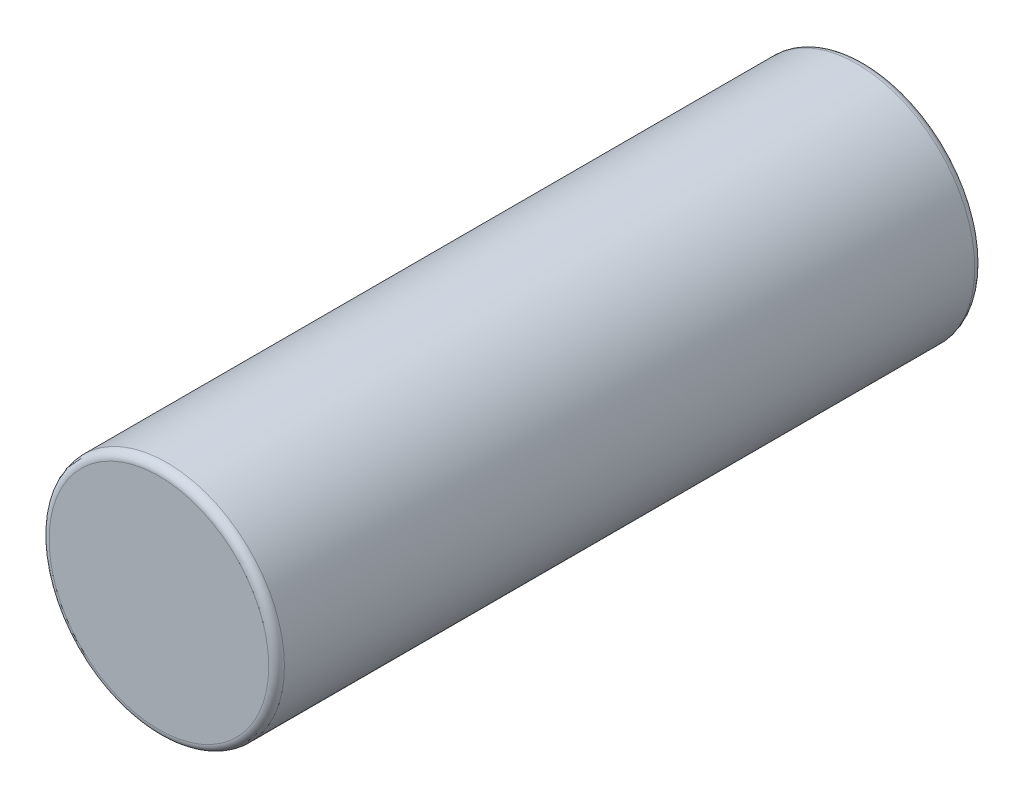
ISO-10303-21;
HEADER;
FILE_DESCRIPTION(('STEP AP214'),'2;1');
FILE_NAME('part.step','',(''),(''),'','','');
FILE_SCHEMA(('AUTOMOTIVE_DESIGN { 1 0 10303 214 1 1 1 1 }'));
ENDSEC;
DATA;
#1=APPLICATION_CONTEXT('core data for automotive mechanical design processes');
#2=APPLICATION_PROTOCOL_DEFINITION('international standard','automotive_design',2000,#1);
#3=PRODUCT_CONTEXT('',#1,'mechanical');
#4=PRODUCT('Part','Part','',(#3));
#5=PRODUCT_RELATED_PRODUCT_CATEGORY('part','',(#4));
#6=PRODUCT_DEFINITION_FORMATION('','',#4);
#7=PRODUCT_DEFINITION_CONTEXT('part definition',#1,'design');
#8=PRODUCT_DEFINITION('design','',#6,#7);
#9=PRODUCT_DEFINITION_SHAPE('','',#8);
#10=(LENGTH_UNIT() NAMED_UNIT(*) SI_UNIT(.MILLI.,.METRE.));
#11=(NAMED_UNIT(*) PLANE_ANGLE_UNIT() SI_UNIT($,.RADIAN.));
#12=(NAMED_UNIT(*) SI_UNIT($,.STERADIAN.) SOLID_ANGLE_UNIT());
#13=UNCERTAINTY_MEASURE_WITH_UNIT(LENGTH_MEASURE(1.E-05),#10,'distance_accuracy_value','');
#14=(GEOMETRIC_REPRESENTATION_CONTEXT(3) GLOBAL_UNCERTAINTY_ASSIGNED_CONTEXT((#13)) GLOBAL_UNIT_ASSIGNED_CONTEXT((#10,
#11,#12)) REPRESENTATION_CONTEXT('',''));
#15=CARTESIAN_POINT('',(0.,0.,0.));
#16=DIRECTION('',(0.,0.,1.));
#17=DIRECTION('',(1.,0.,0.));
#18=AXIS2_PLACEMENT_3D('',#15,#16,#17);
#19=CARTESIAN_POINT('',(0.,0.,-2.25));
#20=DIRECTION('',(0.,0.,1.));
#21=DIRECTION('',(1.,0.,0.));
#22=AXIS2_PLACEMENT_3D('',#19,#20,#21);
#23=CYLINDRICAL_SURFACE('',#22,0.75);
#24=CARTESIAN_POINT('',(0.,0.,-2.2));
#25=DIRECTION('',(0.,0.,1.));
#26=DIRECTION('',(1.,0.,0.));
#27=AXIS2_PLACEMENT_3D('',#24,#25,#26);
#28=CIRCLE('',#27,0.75);
#29=CARTESIAN_POINT('',(0.75,0.,-2.2));
#30=VERTEX_POINT('',#29);
#31=EDGE_CURVE('E45',#30,#30,#28,.T.);
#32=ORIENTED_EDGE('',*,*,#31,.T.);
#33=EDGE_LOOP('',(#32));
#34=FACE_BOUND('',#33,.T.);
#35=CARTESIAN_POINT('',(0.,0.,2.2));
#36=DIRECTION('',(0.,0.,1.));
#37=DIRECTION('',(1.,0.,0.));
#38=AXIS2_PLACEMENT_3D('',#35,#36,#37);
#39=CIRCLE('',#38,0.75);
#40=CARTESIAN_POINT('',(0.75,0.,2.2));
#41=VERTEX_POINT('',#40);
#42=EDGE_CURVE('E49',#41,#41,#39,.F.);
#43=ORIENTED_EDGE('',*,*,#42,.T.);
#44=EDGE_LOOP('',(#43));
#45=FACE_BOUND('',#44,.T.);
#46=ADVANCED_FACE('F34',(#34,#45),#23,.T.);
#47=CARTESIAN_POINT('',(0.,0.,-2.25));
#48=DIRECTION('',(0.,0.,1.));
#49=DIRECTION('',(1.,0.,0.));
#50=AXIS2_PLACEMENT_3D('',#47,#48,#49);
#51=PLANE('',#50);
#52=CARTESIAN_POINT('',(0.,0.,-2.25));
#53=DIRECTION('',(0.,0.,1.));
#54=DIRECTION('',(1.,0.,0.));
#55=AXIS2_PLACEMENT_3D('',#52,#53,#54);
#56=CIRCLE('',#55,0.7);
#57=CARTESIAN_POINT('',(0.7,0.,-2.25));
#58=VERTEX_POINT('',#57);
#59=EDGE_CURVE('E41',#58,#58,#56,.F.);
#60=ORIENTED_EDGE('',*,*,#59,.T.);
#61=EDGE_LOOP('',(#60));
#62=FACE_BOUND('',#61,.T.);
#63=ADVANCED_FACE('F65',(#62),#51,.F.);
#64=CARTESIAN_POINT('',(0.,0.,2.25));
#65=DIRECTION('',(0.,0.,1.));
#66=DIRECTION('',(1.,0.,0.));
#67=AXIS2_PLACEMENT_3D('',#64,#65,#66);
#68=PLANE('',#67);
#69=CARTESIAN_POINT('',(0.,0.,2.25));
#70=DIRECTION('',(0.,0.,1.));
#71=DIRECTION('',(1.,0.,0.));
#72=AXIS2_PLACEMENT_3D('',#69,#70,#71);
#73=CIRCLE('',#72,0.7);
#74=CARTESIAN_POINT('',(0.7,0.,2.25));
#75=VERTEX_POINT('',#74);
#76=EDGE_CURVE('E10',#75,#75,#73,.T.);
#77=ORIENTED_EDGE('',*,*,#76,.T.);
#78=EDGE_LOOP('',(#77));
#79=FACE_BOUND('',#78,.T.);
#80=ADVANCED_FACE('F62',(#79),#68,.T.);
#81=CARTESIAN_POINT('',(0.,0.,-2.2));
#82=DIRECTION('',(0.,0.,1.));
#83=DIRECTION('',(1.,0.,0.));
#84=AXIS2_PLACEMENT_3D('',#81,#82,#83);
#85=TOROIDAL_SURFACE('',#84,0.7,0.05);
#86=ORIENTED_EDGE('',*,*,#59,.F.);
#87=EDGE_LOOP('',(#86));
#88=FACE_BOUND('',#87,.T.);
#89=ORIENTED_EDGE('',*,*,#31,.F.);
#90=EDGE_LOOP('',(#89));
#91=FACE_BOUND('',#90,.T.);
#92=ADVANCED_FACE('F58',(#88,#91),#85,.T.);
#93=CARTESIAN_POINT('',(0.,0.,2.2));
#94=DIRECTION('',(0.,0.,1.));
#95=DIRECTION('',(1.,0.,0.));
#96=AXIS2_PLACEMENT_3D('',#93,#94,#95);
#97=TOROIDAL_SURFACE('',#96,0.7,0.05);
#98=ORIENTED_EDGE('',*,*,#42,.F.);
#99=EDGE_LOOP('',(#98));
#100=FACE_BOUND('',#99,.T.);
#101=ORIENTED_EDGE('',*,*,#76,.F.);
#102=EDGE_LOOP('',(#101));
#103=FACE_BOUND('',#102,.T.);
#104=ADVANCED_FACE('F36',(#100,#103),#97,.T.);
#105=CLOSED_SHELL('',(#46,#63,#80,#92,#104));
#106=MANIFOLD_SOLID_BREP('B2',#105);
#107=ADVANCED_BREP_SHAPE_REPRESENTATION('',(#18,#106),#14);
#108=SHAPE_DEFINITION_REPRESENTATION(#9,#107);
ENDSEC;
END-ISO-10303-21;
